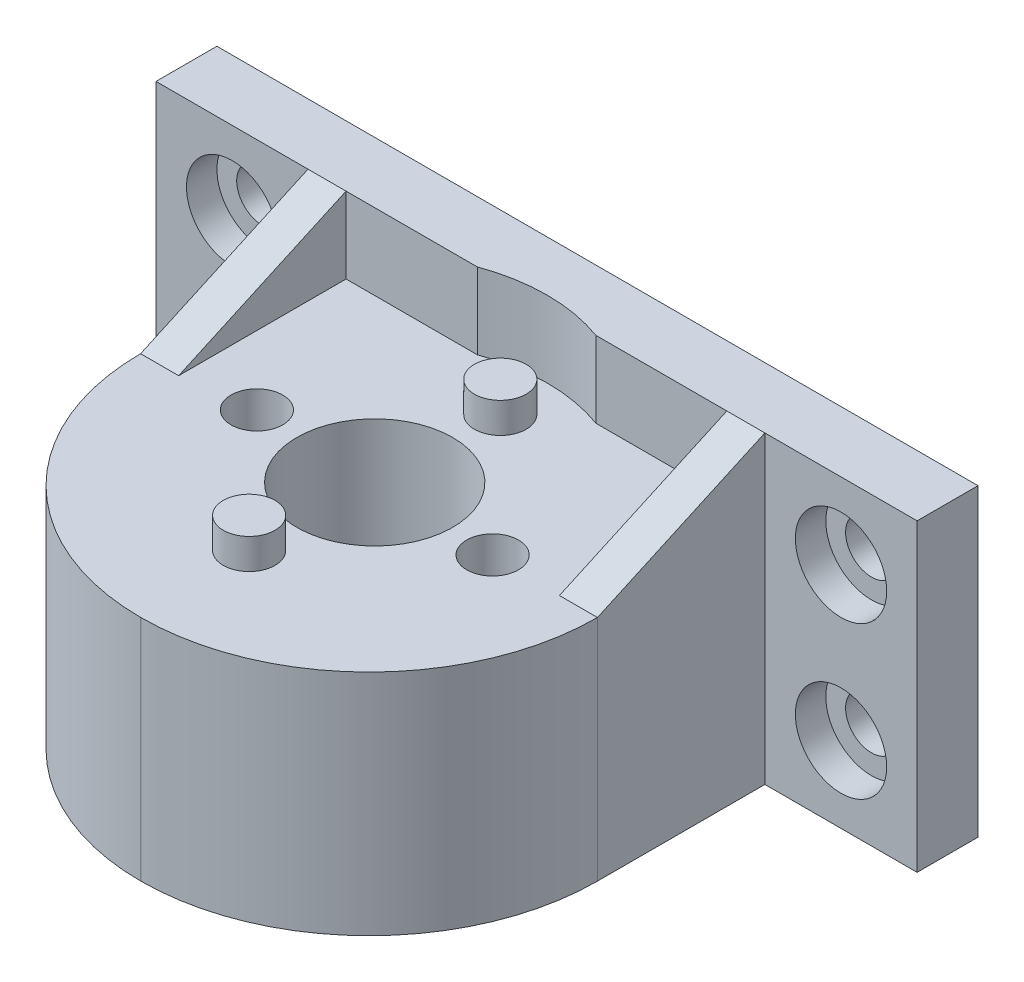
ISO-10303-21;
HEADER;
FILE_DESCRIPTION(('STEP AP214'),'2;1');
FILE_NAME('part.step','',(''),(''),'','','');
FILE_SCHEMA(('AUTOMOTIVE_DESIGN { 1 0 10303 214 1 1 1 1 }'));
ENDSEC;
DATA;
#1=APPLICATION_CONTEXT('core data for automotive mechanical design processes');
#2=APPLICATION_PROTOCOL_DEFINITION('international standard','automotive_design',2000,#1);
#3=PRODUCT_CONTEXT('',#1,'mechanical');
#4=PRODUCT('Part','Part','',(#3));
#5=PRODUCT_RELATED_PRODUCT_CATEGORY('part','',(#4));
#6=PRODUCT_DEFINITION_FORMATION('','',#4);
#7=PRODUCT_DEFINITION_CONTEXT('part definition',#1,'design');
#8=PRODUCT_DEFINITION('design','',#6,#7);
#9=PRODUCT_DEFINITION_SHAPE('','',#8);
#10=(LENGTH_UNIT() NAMED_UNIT(*) SI_UNIT(.MILLI.,.METRE.));
#11=(NAMED_UNIT(*) PLANE_ANGLE_UNIT() SI_UNIT($,.RADIAN.));
#12=(NAMED_UNIT(*) SI_UNIT($,.STERADIAN.) SOLID_ANGLE_UNIT());
#13=UNCERTAINTY_MEASURE_WITH_UNIT(LENGTH_MEASURE(1.E-05),#10,'distance_accuracy_value','');
#14=(GEOMETRIC_REPRESENTATION_CONTEXT(3) GLOBAL_UNCERTAINTY_ASSIGNED_CONTEXT((#13)) GLOBAL_UNIT_ASSIGNED_CONTEXT((#10,
#11,#12)) REPRESENTATION_CONTEXT('',''));
#15=CARTESIAN_POINT('',(0.,0.,0.));
#16=DIRECTION('',(0.,0.,1.));
#17=DIRECTION('',(1.,0.,0.));
#18=AXIS2_PLACEMENT_3D('',#15,#16,#17);
#19=CARTESIAN_POINT('',(0.,0.,4.));
#20=DIRECTION('',(0.,0.,1.));
#21=DIRECTION('',(1.,0.,0.));
#22=AXIS2_PLACEMENT_3D('',#19,#20,#21);
#23=PLANE('',#22);
#24=DIRECTION('',(-1.,0.,0.));
#25=VECTOR('',#24,1.);
#26=CARTESIAN_POINT('',(0.,75.,4.));
#27=LINE('',#26,#25);
#28=CARTESIAN_POINT('',(-139.9,75.,4.));
#29=VERTEX_POINT('',#28);
#30=CARTESIAN_POINT('',(-148.507432970957,75.,4.));
#31=VERTEX_POINT('',#30);
#32=EDGE_CURVE('E197',#29,#31,#27,.T.);
#33=ORIENTED_EDGE('',*,*,#32,.F.);
#34=DIRECTION('',(0.,-1.,0.));
#35=VECTOR('',#34,1.);
#36=CARTESIAN_POINT('',(-139.9,0.,4.));
#37=LINE('',#36,#35);
#38=CARTESIAN_POINT('',(-139.9,80.,4.));
#39=VERTEX_POINT('',#38);
#40=EDGE_CURVE('E189',#39,#29,#37,.T.);
#41=ORIENTED_EDGE('',*,*,#40,.F.);
#42=DIRECTION('',(1.,0.,0.));
#43=VECTOR('',#42,1.);
#44=CARTESIAN_POINT('',(0.,80.,4.));
#45=LINE('',#44,#43);
#46=CARTESIAN_POINT('',(-148.507432970957,80.,4.));
#47=VERTEX_POINT('',#46);
#48=EDGE_CURVE('E196',#47,#39,#45,.T.);
#49=ORIENTED_EDGE('',*,*,#48,.F.);
#50=DIRECTION('',(0.,1.,0.));
#51=VECTOR('',#50,1.);
#52=CARTESIAN_POINT('',(-148.507432970957,67.1843305884659,4.));
#53=LINE('',#52,#51);
#54=EDGE_CURVE('E924',#31,#47,#53,.T.);
#55=ORIENTED_EDGE('',*,*,#54,.F.);
#56=EDGE_LOOP('',(#33,#41,#49,#55));
#57=FACE_BOUND('',#56,.T.);
#58=ADVANCED_FACE('F51',(#57),#23,.T.);
#59=CARTESIAN_POINT('',(-164.914038192639,80.,4.));
#60=VERTEX_POINT('',#59);
#61=CARTESIAN_POINT('',(-156.292567029197,80.,4.));
#62=VERTEX_POINT('',#61);
#63=EDGE_CURVE('E66',#60,#62,#45,.T.);
#64=ORIENTED_EDGE('',*,*,#63,.F.);
#65=DIRECTION('',(0.,-1.,0.));
#66=VECTOR('',#65,1.);
#67=CARTESIAN_POINT('',(-164.914038192639,0.,4.));
#68=LINE('',#67,#66);
#69=CARTESIAN_POINT('',(-164.914038192639,75.,4.));
#70=VERTEX_POINT('',#69);
#71=EDGE_CURVE('E905',#60,#70,#68,.T.);
#72=ORIENTED_EDGE('',*,*,#71,.T.);
#73=CARTESIAN_POINT('',(-156.292567029197,75.,4.));
#74=VERTEX_POINT('',#73);
#75=EDGE_CURVE('E949',#74,#70,#27,.T.);
#76=ORIENTED_EDGE('',*,*,#75,.F.);
#77=DIRECTION('',(0.,1.,0.));
#78=VECTOR('',#77,1.);
#79=CARTESIAN_POINT('',(-156.292567029197,67.1843305884659,4.));
#80=LINE('',#79,#78);
#81=EDGE_CURVE('E928',#74,#62,#80,.T.);
#82=ORIENTED_EDGE('',*,*,#81,.T.);
#83=EDGE_LOOP('',(#64,#72,#76,#82));
#84=FACE_BOUND('',#83,.T.);
#85=ADVANCED_FACE('F398',(#84),#23,.T.);
#86=CARTESIAN_POINT('',(-137.4,80.,4.));
#87=VERTEX_POINT('',#86);
#88=CARTESIAN_POINT('',(-127.4,80.,4.));
#89=VERTEX_POINT('',#88);
#90=EDGE_CURVE('E203',#87,#89,#45,.T.);
#91=ORIENTED_EDGE('',*,*,#90,.F.);
#92=DIRECTION('',(0.,-1.,0.));
#93=VECTOR('',#92,1.);
#94=CARTESIAN_POINT('',(-137.4,75.,4.));
#95=LINE('',#94,#93);
#96=CARTESIAN_POINT('',(-137.4,60.,4.));
#97=VERTEX_POINT('',#96);
#98=EDGE_CURVE('E324',#87,#97,#95,.T.);
#99=ORIENTED_EDGE('',*,*,#98,.T.);
#100=DIRECTION('',(1.,0.,0.));
#101=VECTOR('',#100,1.);
#102=CARTESIAN_POINT('',(0.,60.,4.));
#103=LINE('',#102,#101);
#104=CARTESIAN_POINT('',(-127.4,60.,4.));
#105=VERTEX_POINT('',#104);
#106=EDGE_CURVE('E241',#97,#105,#103,.T.);
#107=ORIENTED_EDGE('',*,*,#106,.T.);
#108=DIRECTION('',(0.,-1.,0.));
#109=VECTOR('',#108,1.);
#110=CARTESIAN_POINT('',(-127.4,0.,4.));
#111=LINE('',#110,#109);
#112=EDGE_CURVE('E206',#89,#105,#111,.T.);
#113=ORIENTED_EDGE('',*,*,#112,.F.);
#114=EDGE_LOOP('',(#91,#99,#107,#113));
#115=FACE_BOUND('',#114,.T.);
#116=CARTESIAN_POINT('',(-132.4,65.,4.));
#117=DIRECTION('',(0.,0.,1.));
#118=DIRECTION('',(1.,0.,0.));
#119=AXIS2_PLACEMENT_3D('',#116,#117,#118);
#120=CIRCLE('',#119,2.99999999999999);
#121=CARTESIAN_POINT('',(-129.4,65.,4.));
#122=VERTEX_POINT('',#121);
#123=EDGE_CURVE('E323',#122,#122,#120,.T.);
#124=ORIENTED_EDGE('',*,*,#123,.F.);
#125=EDGE_LOOP('',(#124));
#126=FACE_BOUND('',#125,.T.);
#127=CARTESIAN_POINT('',(-132.4,75.,4.));
#128=DIRECTION('',(0.,0.,1.));
#129=DIRECTION('',(1.,0.,0.));
#130=AXIS2_PLACEMENT_3D('',#127,#128,#129);
#131=CIRCLE('',#130,2.99999999999999);
#132=CARTESIAN_POINT('',(-129.4,75.,4.));
#133=VERTEX_POINT('',#132);
#134=EDGE_CURVE('E329',#133,#133,#131,.T.);
#135=ORIENTED_EDGE('',*,*,#134,.F.);
#136=EDGE_LOOP('',(#135));
#137=FACE_BOUND('',#136,.T.);
#138=ADVANCED_FACE('F359',(#115,#126,#137),#23,.T.);
#139=CARTESIAN_POINT('',(-172.4,65.,4.));
#140=DIRECTION('',(0.,0.,-1.));
#141=DIRECTION('',(-1.,0.,0.));
#142=AXIS2_PLACEMENT_3D('',#139,#140,#141);
#143=CYLINDRICAL_SURFACE('',#142,1.70000000000001);
#144=DIRECTION('',(0.,0.,-1.));
#145=VECTOR('',#144,1.);
#146=CARTESIAN_POINT('',(-174.1,65.,4.));
#147=LINE('',#146,#145);
#148=CARTESIAN_POINT('',(-174.1,65.,2.));
#149=VERTEX_POINT('',#148);
#150=CARTESIAN_POINT('',(-174.1,65.,0.));
#151=VERTEX_POINT('',#150);
#152=EDGE_CURVE('E214',#149,#151,#147,.T.);
#153=ORIENTED_EDGE('',*,*,#152,.F.);
#154=CARTESIAN_POINT('',(-172.4,65.,2.));
#155=DIRECTION('',(0.,0.,1.));
#156=DIRECTION('',(1.,0.,0.));
#157=AXIS2_PLACEMENT_3D('',#154,#155,#156);
#158=CIRCLE('',#157,1.70000000000001);
#159=CARTESIAN_POINT('',(-172.4,63.3,2.));
#160=VERTEX_POINT('',#159);
#161=EDGE_CURVE('E263',#149,#160,#158,.T.);
#162=ORIENTED_EDGE('',*,*,#161,.T.);
#163=DIRECTION('',(0.,0.,-1.));
#164=VECTOR('',#163,1.);
#165=CARTESIAN_POINT('',(-172.4,63.3,4.));
#166=LINE('',#165,#164);
#167=CARTESIAN_POINT('',(-172.4,63.3,0.));
#168=VERTEX_POINT('',#167);
#169=EDGE_CURVE('E211',#160,#168,#166,.T.);
#170=ORIENTED_EDGE('',*,*,#169,.T.);
#171=CARTESIAN_POINT('',(-172.4,65.,0.));
#172=DIRECTION('',(0.,0.,1.));
#173=DIRECTION('',(1.,0.,0.));
#174=AXIS2_PLACEMENT_3D('',#171,#172,#173);
#175=CIRCLE('',#174,1.70000000000001);
#176=EDGE_CURVE('E227',#151,#168,#175,.T.);
#177=ORIENTED_EDGE('',*,*,#176,.F.);
#178=EDGE_LOOP('',(#153,#162,#170,#177));
#179=FACE_BOUND('',#178,.T.);
#180=ADVANCED_FACE('F415',(#179),#143,.F.);
#181=CARTESIAN_POINT('',(-172.4,75.,4.));
#182=DIRECTION('',(0.,0.,-1.));
#183=DIRECTION('',(-1.,0.,0.));
#184=AXIS2_PLACEMENT_3D('',#181,#182,#183);
#185=CYLINDRICAL_SURFACE('',#184,1.70000000000001);
#186=CARTESIAN_POINT('',(-172.4,75.,0.));
#187=DIRECTION('',(0.,0.,1.));
#188=DIRECTION('',(1.,0.,0.));
#189=AXIS2_PLACEMENT_3D('',#186,#187,#188);
#190=CIRCLE('',#189,1.70000000000001);
#191=CARTESIAN_POINT('',(-170.7,75.,0.));
#192=VERTEX_POINT('',#191);
#193=EDGE_CURVE('E224',#192,#192,#190,.T.);
#194=ORIENTED_EDGE('',*,*,#193,.F.);
#195=EDGE_LOOP('',(#194));
#196=FACE_BOUND('',#195,.T.);
#197=CARTESIAN_POINT('',(-172.4,75.,2.));
#198=DIRECTION('',(0.,0.,1.));
#199=DIRECTION('',(1.,0.,0.));
#200=AXIS2_PLACEMENT_3D('',#197,#198,#199);
#201=CIRCLE('',#200,1.70000000000001);
#202=CARTESIAN_POINT('',(-170.7,75.,2.));
#203=VERTEX_POINT('',#202);
#204=EDGE_CURVE('E221',#203,#203,#201,.T.);
#205=ORIENTED_EDGE('',*,*,#204,.T.);
#206=EDGE_LOOP('',(#205));
#207=FACE_BOUND('',#206,.T.);
#208=ADVANCED_FACE('F418',(#196,#207),#185,.F.);
#209=CARTESIAN_POINT('',(-132.4,75.,4.));
#210=DIRECTION('',(0.,0.,-1.));
#211=DIRECTION('',(-1.,0.,0.));
#212=AXIS2_PLACEMENT_3D('',#209,#210,#211);
#213=CYLINDRICAL_SURFACE('',#212,1.70000000000001);
#214=CARTESIAN_POINT('',(-132.4,75.,0.));
#215=DIRECTION('',(0.,0.,1.));
#216=DIRECTION('',(1.,0.,0.));
#217=AXIS2_PLACEMENT_3D('',#214,#215,#216);
#218=CIRCLE('',#217,1.70000000000001);
#219=CARTESIAN_POINT('',(-130.7,75.,0.));
#220=VERTEX_POINT('',#219);
#221=EDGE_CURVE('E220',#220,#220,#218,.T.);
#222=ORIENTED_EDGE('',*,*,#221,.F.);
#223=EDGE_LOOP('',(#222));
#224=FACE_BOUND('',#223,.T.);
#225=CARTESIAN_POINT('',(-132.4,75.,2.));
#226=DIRECTION('',(0.,0.,1.));
#227=DIRECTION('',(1.,0.,0.));
#228=AXIS2_PLACEMENT_3D('',#225,#226,#227);
#229=CIRCLE('',#228,1.70000000000001);
#230=CARTESIAN_POINT('',(-130.7,75.,2.));
#231=VERTEX_POINT('',#230);
#232=EDGE_CURVE('E262',#231,#231,#229,.T.);
#233=ORIENTED_EDGE('',*,*,#232,.T.);
#234=EDGE_LOOP('',(#233));
#235=FACE_BOUND('',#234,.T.);
#236=ADVANCED_FACE('F422',(#224,#235),#213,.F.);
#237=CARTESIAN_POINT('',(-132.4,65.,4.));
#238=DIRECTION('',(0.,0.,-1.));
#239=DIRECTION('',(-1.,0.,0.));
#240=AXIS2_PLACEMENT_3D('',#237,#238,#239);
#241=CYLINDRICAL_SURFACE('',#240,1.70000000000001);
#242=CARTESIAN_POINT('',(-132.4,65.,0.));
#243=DIRECTION('',(0.,0.,1.));
#244=DIRECTION('',(1.,0.,0.));
#245=AXIS2_PLACEMENT_3D('',#242,#243,#244);
#246=CIRCLE('',#245,1.70000000000001);
#247=CARTESIAN_POINT('',(-130.7,65.,0.));
#248=VERTEX_POINT('',#247);
#249=EDGE_CURVE('E217',#248,#248,#246,.T.);
#250=ORIENTED_EDGE('',*,*,#249,.F.);
#251=EDGE_LOOP('',(#250));
#252=FACE_BOUND('',#251,.T.);
#253=CARTESIAN_POINT('',(-132.4,65.,2.));
#254=DIRECTION('',(0.,0.,1.));
#255=DIRECTION('',(1.,0.,0.));
#256=AXIS2_PLACEMENT_3D('',#253,#254,#255);
#257=CIRCLE('',#256,1.70000000000001);
#258=CARTESIAN_POINT('',(-130.7,65.,2.));
#259=VERTEX_POINT('',#258);
#260=EDGE_CURVE('E259',#259,#259,#257,.T.);
#261=ORIENTED_EDGE('',*,*,#260,.T.);
#262=EDGE_LOOP('',(#261));
#263=FACE_BOUND('',#262,.T.);
#264=ADVANCED_FACE('F426',(#252,#263),#241,.F.);
#265=CARTESIAN_POINT('',(-172.4,65.,4.));
#266=DIRECTION('',(0.,0.,-1.));
#267=DIRECTION('',(-1.,0.,0.));
#268=AXIS2_PLACEMENT_3D('',#265,#266,#267);
#269=CYLINDRICAL_SURFACE('',#268,1.70000000000001);
#270=ORIENTED_EDGE('',*,*,#169,.F.);
#271=CARTESIAN_POINT('',(-172.4,65.,2.));
#272=DIRECTION('',(0.,0.,1.));
#273=DIRECTION('',(1.,0.,0.));
#274=AXIS2_PLACEMENT_3D('',#271,#272,#273);
#275=CIRCLE('',#274,1.70000000000001);
#276=EDGE_CURVE('E255',#160,#149,#275,.T.);
#277=ORIENTED_EDGE('',*,*,#276,.T.);
#278=ORIENTED_EDGE('',*,*,#152,.T.);
#279=CARTESIAN_POINT('',(-172.4,65.,0.));
#280=DIRECTION('',(0.,0.,1.));
#281=DIRECTION('',(1.,0.,0.));
#282=AXIS2_PLACEMENT_3D('',#279,#280,#281);
#283=CIRCLE('',#282,1.70000000000001);
#284=EDGE_CURVE('E250',#151,#168,#283,.F.);
#285=ORIENTED_EDGE('',*,*,#284,.T.);
#286=EDGE_LOOP('',(#270,#277,#278,#285));
#287=FACE_BOUND('',#286,.T.);
#288=ADVANCED_FACE('F373',(#287),#269,.F.);
#289=DIRECTION('',(0.,-1.,0.));
#290=VECTOR('',#289,1.);
#291=CARTESIAN_POINT('',(-167.414038192639,75.,4.));
#292=LINE('',#291,#290);
#293=CARTESIAN_POINT('',(-167.414038192639,80.,4.));
#294=VERTEX_POINT('',#293);
#295=CARTESIAN_POINT('',(-167.414038192639,60.,4.));
#296=VERTEX_POINT('',#295);
#297=EDGE_CURVE('E74',#294,#296,#292,.T.);
#298=ORIENTED_EDGE('',*,*,#297,.F.);
#299=CARTESIAN_POINT('',(-177.4,80.,4.));
#300=VERTEX_POINT('',#299);
#301=EDGE_CURVE('E205',#300,#294,#45,.T.);
#302=ORIENTED_EDGE('',*,*,#301,.F.);
#303=DIRECTION('',(0.,-1.,0.));
#304=VECTOR('',#303,1.);
#305=CARTESIAN_POINT('',(-177.4,0.,4.));
#306=LINE('',#305,#304);
#307=CARTESIAN_POINT('',(-177.4,60.,4.));
#308=VERTEX_POINT('',#307);
#309=EDGE_CURVE('E209',#300,#308,#306,.T.);
#310=ORIENTED_EDGE('',*,*,#309,.T.);
#311=EDGE_CURVE('E351',#308,#296,#103,.T.);
#312=ORIENTED_EDGE('',*,*,#311,.T.);
#313=EDGE_LOOP('',(#298,#302,#310,#312));
#314=FACE_BOUND('',#313,.T.);
#315=CARTESIAN_POINT('',(-172.4,65.,4.));
#316=DIRECTION('',(0.,0.,1.));
#317=DIRECTION('',(1.,0.,0.));
#318=AXIS2_PLACEMENT_3D('',#315,#316,#317);
#319=CIRCLE('',#318,2.99999999999999);
#320=CARTESIAN_POINT('',(-169.4,65.,4.));
#321=VERTEX_POINT('',#320);
#322=EDGE_CURVE('E336',#321,#321,#319,.T.);
#323=ORIENTED_EDGE('',*,*,#322,.F.);
#324=EDGE_LOOP('',(#323));
#325=FACE_BOUND('',#324,.T.);
#326=CARTESIAN_POINT('',(-172.4,75.,4.));
#327=DIRECTION('',(0.,0.,1.));
#328=DIRECTION('',(1.,0.,0.));
#329=AXIS2_PLACEMENT_3D('',#326,#327,#328);
#330=CIRCLE('',#329,2.99999999999999);
#331=CARTESIAN_POINT('',(-169.4,75.,4.));
#332=VERTEX_POINT('',#331);
#333=EDGE_CURVE('E335',#332,#332,#330,.T.);
#334=ORIENTED_EDGE('',*,*,#333,.F.);
#335=EDGE_LOOP('',(#334));
#336=FACE_BOUND('',#335,.T.);
#337=ADVANCED_FACE('F370',(#314,#325,#336),#23,.T.);
#338=CARTESIAN_POINT('',(0.,0.,0.));
#339=DIRECTION('',(0.,0.,1.));
#340=DIRECTION('',(1.,0.,0.));
#341=AXIS2_PLACEMENT_3D('',#338,#339,#340);
#342=PLANE('',#341);
#343=DIRECTION('',(1.,0.,0.));
#344=VECTOR('',#343,1.);
#345=CARTESIAN_POINT('',(0.,60.,0.));
#346=LINE('',#345,#344);
#347=CARTESIAN_POINT('',(-177.4,60.,0.));
#348=VERTEX_POINT('',#347);
#349=CARTESIAN_POINT('',(-127.4,60.,0.));
#350=VERTEX_POINT('',#349);
#351=EDGE_CURVE('E230',#348,#350,#346,.T.);
#352=ORIENTED_EDGE('',*,*,#351,.F.);
#353=DIRECTION('',(0.,-1.,0.));
#354=VECTOR('',#353,1.);
#355=CARTESIAN_POINT('',(-177.4,0.,0.));
#356=LINE('',#355,#354);
#357=CARTESIAN_POINT('',(-177.4,80.,0.));
#358=VERTEX_POINT('',#357);
#359=EDGE_CURVE('E239',#358,#348,#356,.T.);
#360=ORIENTED_EDGE('',*,*,#359,.F.);
#361=DIRECTION('',(1.,0.,0.));
#362=VECTOR('',#361,1.);
#363=CARTESIAN_POINT('',(0.,80.,0.));
#364=LINE('',#363,#362);
#365=CARTESIAN_POINT('',(-127.4,80.,0.));
#366=VERTEX_POINT('',#365);
#367=EDGE_CURVE('E236',#358,#366,#364,.T.);
#368=ORIENTED_EDGE('',*,*,#367,.T.);
#369=DIRECTION('',(0.,-1.,0.));
#370=VECTOR('',#369,1.);
#371=CARTESIAN_POINT('',(-127.4,0.,0.));
#372=LINE('',#371,#370);
#373=EDGE_CURVE('E233',#366,#350,#372,.T.);
#374=ORIENTED_EDGE('',*,*,#373,.T.);
#375=EDGE_LOOP('',(#352,#360,#368,#374));
#376=FACE_BOUND('',#375,.T.);
#377=ORIENTED_EDGE('',*,*,#193,.T.);
#378=EDGE_LOOP('',(#377));
#379=FACE_BOUND('',#378,.T.);
#380=ORIENTED_EDGE('',*,*,#221,.T.);
#381=EDGE_LOOP('',(#380));
#382=FACE_BOUND('',#381,.T.);
#383=ORIENTED_EDGE('',*,*,#249,.T.);
#384=EDGE_LOOP('',(#383));
#385=FACE_BOUND('',#384,.T.);
#386=ORIENTED_EDGE('',*,*,#284,.F.);
#387=ORIENTED_EDGE('',*,*,#176,.T.);
#388=EDGE_LOOP('',(#386,#387));
#389=FACE_BOUND('',#388,.T.);
#390=ADVANCED_FACE('F365',(#376,#379,#382,#385,#389),#342,.F.);
#391=CARTESIAN_POINT('',(0.,60.,4.));
#392=DIRECTION('',(0.,1.,0.));
#393=DIRECTION('',(0.,0.,1.));
#394=AXIS2_PLACEMENT_3D('',#391,#392,#393);
#395=PLANE('',#394);
#396=CARTESIAN_POINT('',(-160.3959884142,60.,14.3781684729765));
#397=DIRECTION('',(0.,1.,0.));
#398=DIRECTION('',(0.,0.,1.));
#399=AXIS2_PLACEMENT_3D('',#396,#397,#398);
#400=CIRCLE('',#399,1.70000000000001);
#401=CARTESIAN_POINT('',(-160.3959884142,60.,16.0781684729765));
#402=VERTEX_POINT('',#401);
#403=EDGE_CURVE('E940',#402,#402,#400,.T.);
#404=ORIENTED_EDGE('',*,*,#403,.T.);
#405=EDGE_LOOP('',(#404));
#406=FACE_BOUND('',#405,.T.);
#407=CARTESIAN_POINT('',(-144.404011585956,60.,14.8848015995177));
#408=DIRECTION('',(0.,1.,0.));
#409=DIRECTION('',(0.,0.,1.));
#410=AXIS2_PLACEMENT_3D('',#407,#408,#409);
#411=CIRCLE('',#410,1.70000000000001);
#412=CARTESIAN_POINT('',(-144.404011585956,60.,16.5848015995177));
#413=VERTEX_POINT('',#412);
#414=EDGE_CURVE('E935',#413,#413,#411,.T.);
#415=ORIENTED_EDGE('',*,*,#414,.T.);
#416=EDGE_LOOP('',(#415));
#417=FACE_BOUND('',#416,.T.);
#418=DIRECTION('',(0.,0.,1.));
#419=VECTOR('',#418,1.);
#420=CARTESIAN_POINT('',(-137.4,60.,0.));
#421=LINE('',#420,#419);
#422=CARTESIAN_POINT('',(-137.4,60.,15.));
#423=VERTEX_POINT('',#422);
#424=EDGE_CURVE('E300',#97,#423,#421,.T.);
#425=ORIENTED_EDGE('',*,*,#424,.T.);
#426=CARTESIAN_POINT('',(-152.4,60.,15.));
#427=DIRECTION('',(0.,1.,0.));
#428=DIRECTION('',(0.,0.,1.));
#429=AXIS2_PLACEMENT_3D('',#426,#427,#428);
#430=CIRCLE('',#429,15.);
#431=CARTESIAN_POINT('',(-152.4,60.,30.));
#432=VERTEX_POINT('',#431);
#433=EDGE_CURVE('E278',#423,#432,#430,.F.);
#434=ORIENTED_EDGE('',*,*,#433,.T.);
#435=DIRECTION('',(1.,0.,0.));
#436=VECTOR('',#435,1.);
#437=CARTESIAN_POINT('',(0.,60.,30.));
#438=LINE('',#437,#436);
#439=CARTESIAN_POINT('',(-152.414038192639,60.,30.));
#440=VERTEX_POINT('',#439);
#441=EDGE_CURVE('E309',#440,#432,#438,.T.);
#442=ORIENTED_EDGE('',*,*,#441,.F.);
#443=CARTESIAN_POINT('',(-152.414038192639,60.,15.));
#444=DIRECTION('',(0.,1.,0.));
#445=DIRECTION('',(0.,0.,1.));
#446=AXIS2_PLACEMENT_3D('',#443,#444,#445);
#447=CIRCLE('',#446,15.);
#448=CARTESIAN_POINT('',(-167.414038192639,60.,15.));
#449=VERTEX_POINT('',#448);
#450=EDGE_CURVE('E276',#440,#449,#447,.F.);
#451=ORIENTED_EDGE('',*,*,#450,.T.);
#452=DIRECTION('',(0.,0.,1.));
#453=VECTOR('',#452,1.);
#454=CARTESIAN_POINT('',(-167.414038192639,60.,0.));
#455=LINE('',#454,#453);
#456=EDGE_CURVE('E312',#296,#449,#455,.T.);
#457=ORIENTED_EDGE('',*,*,#456,.F.);
#458=ORIENTED_EDGE('',*,*,#311,.F.);
#459=DIRECTION('',(0.,0.,-1.));
#460=VECTOR('',#459,1.);
#461=CARTESIAN_POINT('',(-177.4,60.,4.));
#462=LINE('',#461,#460);
#463=EDGE_CURVE('E242',#308,#348,#462,.T.);
#464=ORIENTED_EDGE('',*,*,#463,.T.);
#465=ORIENTED_EDGE('',*,*,#351,.T.);
#466=DIRECTION('',(0.,0.,-1.));
#467=VECTOR('',#466,1.);
#468=CARTESIAN_POINT('',(-127.4,60.,4.));
#469=LINE('',#468,#467);
#470=EDGE_CURVE('E249',#105,#350,#469,.T.);
#471=ORIENTED_EDGE('',*,*,#470,.F.);
#472=ORIENTED_EDGE('',*,*,#106,.F.);
#473=EDGE_LOOP('',(#425,#434,#442,#451,#457,#458,#464,#465,#471,#472));
#474=FACE_BOUND('',#473,.T.);
#475=CARTESIAN_POINT('',(-152.400000000077,60.,14.6314850362471));
#476=DIRECTION('',(0.,-1.,0.));
#477=DIRECTION('',(0.,0.,-1.));
#478=AXIS2_PLACEMENT_3D('',#475,#476,#477);
#479=CIRCLE('',#478,5.12000000000001);
#480=CARTESIAN_POINT('',(-152.400000000077,60.,9.51148503624708));
#481=VERTEX_POINT('',#480);
#482=EDGE_CURVE('E310',#481,#481,#479,.T.);
#483=ORIENTED_EDGE('',*,*,#482,.F.);
#484=EDGE_LOOP('',(#483));
#485=FACE_BOUND('',#484,.T.);
#486=ADVANCED_FACE('F304',(#406,#417,#474,#485),#395,.F.);
#487=CARTESIAN_POINT('',(-127.4,0.,4.));
#488=DIRECTION('',(1.,0.,0.));
#489=DIRECTION('',(0.,0.,-1.));
#490=AXIS2_PLACEMENT_3D('',#487,#488,#489);
#491=PLANE('',#490);
#492=ORIENTED_EDGE('',*,*,#373,.F.);
#493=DIRECTION('',(0.,0.,-1.));
#494=VECTOR('',#493,1.);
#495=CARTESIAN_POINT('',(-127.4,80.,4.));
#496=LINE('',#495,#494);
#497=EDGE_CURVE('E247',#89,#366,#496,.T.);
#498=ORIENTED_EDGE('',*,*,#497,.F.);
#499=ORIENTED_EDGE('',*,*,#112,.T.);
#500=ORIENTED_EDGE('',*,*,#470,.T.);
#501=EDGE_LOOP('',(#492,#498,#499,#500));
#502=FACE_BOUND('',#501,.T.);
#503=ADVANCED_FACE('F357',(#502),#491,.T.);
#504=CARTESIAN_POINT('',(0.,80.,4.));
#505=DIRECTION('',(0.,1.,0.));
#506=DIRECTION('',(0.,0.,1.));
#507=AXIS2_PLACEMENT_3D('',#504,#505,#506);
#508=PLANE('',#507);
#509=CARTESIAN_POINT('',(-152.400000000077,80.,14.6314850362471));
#510=DIRECTION('',(0.,1.,0.));
#511=DIRECTION('',(0.,0.,-1.));
#512=AXIS2_PLACEMENT_3D('',#509,#510,#511);
#513=CIRCLE('',#512,11.321685040317);
#514=EDGE_CURVE('E202',#47,#62,#513,.T.);
#515=ORIENTED_EDGE('',*,*,#514,.F.);
#516=ORIENTED_EDGE('',*,*,#48,.T.);
#517=DIRECTION('',(1.,0.,0.));
#518=VECTOR('',#517,1.);
#519=CARTESIAN_POINT('',(-139.9,80.,4.));
#520=LINE('',#519,#518);
#521=EDGE_CURVE('E173',#39,#87,#520,.T.);
#522=ORIENTED_EDGE('',*,*,#521,.T.);
#523=ORIENTED_EDGE('',*,*,#90,.T.);
#524=ORIENTED_EDGE('',*,*,#497,.T.);
#525=ORIENTED_EDGE('',*,*,#367,.F.);
#526=DIRECTION('',(0.,0.,-1.));
#527=VECTOR('',#526,1.);
#528=CARTESIAN_POINT('',(-177.4,80.,4.));
#529=LINE('',#528,#527);
#530=EDGE_CURVE('E245',#300,#358,#529,.T.);
#531=ORIENTED_EDGE('',*,*,#530,.F.);
#532=ORIENTED_EDGE('',*,*,#301,.T.);
#533=DIRECTION('',(-1.,0.,0.));
#534=VECTOR('',#533,1.);
#535=CARTESIAN_POINT('',(-164.914038192639,80.,4.));
#536=LINE('',#535,#534);
#537=EDGE_CURVE('E920',#60,#294,#536,.T.);
#538=ORIENTED_EDGE('',*,*,#537,.F.);
#539=ORIENTED_EDGE('',*,*,#63,.T.);
#540=EDGE_LOOP('',(#515,#516,#522,#523,#524,#525,#531,#532,#538,#539));
#541=FACE_BOUND('',#540,.T.);
#542=ADVANCED_FACE('F200',(#541),#508,.T.);
#543=CARTESIAN_POINT('',(-177.4,0.,4.));
#544=DIRECTION('',(1.,0.,0.));
#545=DIRECTION('',(0.,0.,-1.));
#546=AXIS2_PLACEMENT_3D('',#543,#544,#545);
#547=PLANE('',#546);
#548=ORIENTED_EDGE('',*,*,#359,.T.);
#549=ORIENTED_EDGE('',*,*,#463,.F.);
#550=ORIENTED_EDGE('',*,*,#309,.F.);
#551=ORIENTED_EDGE('',*,*,#530,.T.);
#552=EDGE_LOOP('',(#548,#549,#550,#551));
#553=FACE_BOUND('',#552,.T.);
#554=ADVANCED_FACE('F369',(#553),#547,.F.);
#555=CARTESIAN_POINT('',(-172.4,65.,2.));
#556=DIRECTION('',(0.,0.,1.));
#557=DIRECTION('',(1.,0.,0.));
#558=AXIS2_PLACEMENT_3D('',#555,#556,#557);
#559=CYLINDRICAL_SURFACE('',#558,2.99999999999999);
#560=CARTESIAN_POINT('',(-172.4,65.,2.));
#561=DIRECTION('',(0.,0.,1.));
#562=DIRECTION('',(1.,0.,0.));
#563=AXIS2_PLACEMENT_3D('',#560,#561,#562);
#564=CIRCLE('',#563,2.99999999999999);
#565=CARTESIAN_POINT('',(-169.4,65.,2.));
#566=VERTEX_POINT('',#565);
#567=EDGE_CURVE('E332',#566,#566,#564,.T.);
#568=ORIENTED_EDGE('',*,*,#567,.F.);
#569=EDGE_LOOP('',(#568));
#570=FACE_BOUND('',#569,.T.);
#571=ORIENTED_EDGE('',*,*,#322,.T.);
#572=EDGE_LOOP('',(#571));
#573=FACE_BOUND('',#572,.T.);
#574=ADVANCED_FACE('F407',(#570,#573),#559,.F.);
#575=CARTESIAN_POINT('',(-172.4,65.,2.));
#576=DIRECTION('',(0.,0.,1.));
#577=DIRECTION('',(1.,0.,0.));
#578=AXIS2_PLACEMENT_3D('',#575,#576,#577);
#579=PLANE('',#578);
#580=ORIENTED_EDGE('',*,*,#276,.F.);
#581=ORIENTED_EDGE('',*,*,#161,.F.);
#582=EDGE_LOOP('',(#580,#581));
#583=FACE_BOUND('',#582,.T.);
#584=ORIENTED_EDGE('',*,*,#567,.T.);
#585=EDGE_LOOP('',(#584));
#586=FACE_BOUND('',#585,.T.);
#587=ADVANCED_FACE('F481',(#583,#586),#579,.T.);
#588=CARTESIAN_POINT('',(-132.4,65.,2.));
#589=DIRECTION('',(0.,0.,1.));
#590=DIRECTION('',(1.,0.,0.));
#591=AXIS2_PLACEMENT_3D('',#588,#589,#590);
#592=CYLINDRICAL_SURFACE('',#591,2.99999999999999);
#593=CARTESIAN_POINT('',(-132.4,65.,2.));
#594=DIRECTION('',(0.,0.,1.));
#595=DIRECTION('',(1.,0.,0.));
#596=AXIS2_PLACEMENT_3D('',#593,#594,#595);
#597=CIRCLE('',#596,2.99999999999999);
#598=CARTESIAN_POINT('',(-129.4,65.,2.));
#599=VERTEX_POINT('',#598);
#600=EDGE_CURVE('E326',#599,#599,#597,.T.);
#601=ORIENTED_EDGE('',*,*,#600,.F.);
#602=EDGE_LOOP('',(#601));
#603=FACE_BOUND('',#602,.T.);
#604=ORIENTED_EDGE('',*,*,#123,.T.);
#605=EDGE_LOOP('',(#604));
#606=FACE_BOUND('',#605,.T.);
#607=ADVANCED_FACE('F477',(#603,#606),#592,.F.);
#608=CARTESIAN_POINT('',(-132.4,65.,2.));
#609=DIRECTION('',(0.,0.,1.));
#610=DIRECTION('',(1.,0.,0.));
#611=AXIS2_PLACEMENT_3D('',#608,#609,#610);
#612=PLANE('',#611);
#613=ORIENTED_EDGE('',*,*,#260,.F.);
#614=EDGE_LOOP('',(#613));
#615=FACE_BOUND('',#614,.T.);
#616=ORIENTED_EDGE('',*,*,#600,.T.);
#617=EDGE_LOOP('',(#616));
#618=FACE_BOUND('',#617,.T.);
#619=ADVANCED_FACE('F474',(#615,#618),#612,.T.);
#620=CARTESIAN_POINT('',(-132.4,75.,2.));
#621=DIRECTION('',(0.,0.,1.));
#622=DIRECTION('',(1.,0.,0.));
#623=AXIS2_PLACEMENT_3D('',#620,#621,#622);
#624=CYLINDRICAL_SURFACE('',#623,2.99999999999999);
#625=CARTESIAN_POINT('',(-132.4,75.,2.));
#626=DIRECTION('',(0.,0.,1.));
#627=DIRECTION('',(1.,0.,0.));
#628=AXIS2_PLACEMENT_3D('',#625,#626,#627);
#629=CIRCLE('',#628,2.99999999999999);
#630=CARTESIAN_POINT('',(-129.4,75.,2.));
#631=VERTEX_POINT('',#630);
#632=EDGE_CURVE('E339',#631,#631,#629,.T.);
#633=ORIENTED_EDGE('',*,*,#632,.F.);
#634=EDGE_LOOP('',(#633));
#635=FACE_BOUND('',#634,.T.);
#636=ORIENTED_EDGE('',*,*,#134,.T.);
#637=EDGE_LOOP('',(#636));
#638=FACE_BOUND('',#637,.T.);
#639=ADVANCED_FACE('F392',(#635,#638),#624,.F.);
#640=CARTESIAN_POINT('',(-132.4,75.,2.));
#641=DIRECTION('',(0.,0.,1.));
#642=DIRECTION('',(1.,0.,0.));
#643=AXIS2_PLACEMENT_3D('',#640,#641,#642);
#644=PLANE('',#643);
#645=ORIENTED_EDGE('',*,*,#232,.F.);
#646=EDGE_LOOP('',(#645));
#647=FACE_BOUND('',#646,.T.);
#648=ORIENTED_EDGE('',*,*,#632,.T.);
#649=EDGE_LOOP('',(#648));
#650=FACE_BOUND('',#649,.T.);
#651=ADVANCED_FACE('F382',(#647,#650),#644,.T.);
#652=CARTESIAN_POINT('',(-172.4,75.,2.));
#653=DIRECTION('',(0.,0.,1.));
#654=DIRECTION('',(1.,0.,0.));
#655=AXIS2_PLACEMENT_3D('',#652,#653,#654);
#656=CYLINDRICAL_SURFACE('',#655,2.99999999999999);
#657=CARTESIAN_POINT('',(-172.4,75.,2.));
#658=DIRECTION('',(0.,0.,1.));
#659=DIRECTION('',(1.,0.,0.));
#660=AXIS2_PLACEMENT_3D('',#657,#658,#659);
#661=CIRCLE('',#660,2.99999999999999);
#662=CARTESIAN_POINT('',(-169.4,75.,2.));
#663=VERTEX_POINT('',#662);
#664=EDGE_CURVE('E344',#663,#663,#661,.T.);
#665=ORIENTED_EDGE('',*,*,#664,.F.);
#666=EDGE_LOOP('',(#665));
#667=FACE_BOUND('',#666,.T.);
#668=ORIENTED_EDGE('',*,*,#333,.T.);
#669=EDGE_LOOP('',(#668));
#670=FACE_BOUND('',#669,.T.);
#671=ADVANCED_FACE('F379',(#667,#670),#656,.F.);
#672=CARTESIAN_POINT('',(-172.4,75.,2.));
#673=DIRECTION('',(0.,0.,1.));
#674=DIRECTION('',(1.,0.,0.));
#675=AXIS2_PLACEMENT_3D('',#672,#673,#674);
#676=PLANE('',#675);
#677=ORIENTED_EDGE('',*,*,#204,.F.);
#678=EDGE_LOOP('',(#677));
#679=FACE_BOUND('',#678,.T.);
#680=ORIENTED_EDGE('',*,*,#664,.T.);
#681=EDGE_LOOP('',(#680));
#682=FACE_BOUND('',#681,.T.);
#683=ADVANCED_FACE('F381',(#679,#682),#676,.T.);
#684=CARTESIAN_POINT('',(-167.414038192639,75.,0.));
#685=DIRECTION('',(1.,0.,0.));
#686=DIRECTION('',(0.,0.,-1.));
#687=AXIS2_PLACEMENT_3D('',#684,#685,#686);
#688=PLANE('',#687);
#689=ORIENTED_EDGE('',*,*,#456,.T.);
#690=DIRECTION('',(0.,-1.,0.));
#691=VECTOR('',#690,1.);
#692=CARTESIAN_POINT('',(-167.414038192639,75.,15.));
#693=LINE('',#692,#691);
#694=CARTESIAN_POINT('',(-167.414038192639,75.,15.));
#695=VERTEX_POINT('',#694);
#696=EDGE_CURVE('E12',#449,#695,#693,.F.);
#697=ORIENTED_EDGE('',*,*,#696,.T.);
#698=DIRECTION('',(0.,0.413802944301184,-0.910366477462605));
#699=VECTOR('',#698,1.);
#700=CARTESIAN_POINT('',(-167.414038192639,67.8082191780822,30.8219178082192));
#701=LINE('',#700,#699);
#702=EDGE_CURVE('E911',#695,#294,#701,.T.);
#703=ORIENTED_EDGE('',*,*,#702,.T.);
#704=ORIENTED_EDGE('',*,*,#297,.T.);
#705=EDGE_LOOP('',(#689,#697,#703,#704));
#706=FACE_BOUND('',#705,.T.);
#707=ADVANCED_FACE('F389',(#706),#688,.F.);
#708=CARTESIAN_POINT('',(0.,75.,30.));
#709=DIRECTION('',(0.,0.,-1.));
#710=DIRECTION('',(-1.,0.,0.));
#711=AXIS2_PLACEMENT_3D('',#708,#709,#710);
#712=PLANE('',#711);
#713=ORIENTED_EDGE('',*,*,#441,.T.);
#714=DIRECTION('',(0.,-1.,0.));
#715=VECTOR('',#714,1.);
#716=CARTESIAN_POINT('',(-152.4,75.,30.));
#717=LINE('',#716,#715);
#718=CARTESIAN_POINT('',(-152.4,75.,30.));
#719=VERTEX_POINT('',#718);
#720=EDGE_CURVE('E283',#432,#719,#717,.F.);
#721=ORIENTED_EDGE('',*,*,#720,.T.);
#722=DIRECTION('',(1.,0.,0.));
#723=VECTOR('',#722,1.);
#724=CARTESIAN_POINT('',(0.,75.,30.));
#725=LINE('',#724,#723);
#726=CARTESIAN_POINT('',(-152.414038192639,75.,30.));
#727=VERTEX_POINT('',#726);
#728=EDGE_CURVE('E293',#727,#719,#725,.T.);
#729=ORIENTED_EDGE('',*,*,#728,.F.);
#730=DIRECTION('',(0.,-1.,0.));
#731=VECTOR('',#730,1.);
#732=CARTESIAN_POINT('',(-152.414038192639,75.,30.));
#733=LINE('',#732,#731);
#734=EDGE_CURVE('E280',#727,#440,#733,.T.);
#735=ORIENTED_EDGE('',*,*,#734,.T.);
#736=EDGE_LOOP('',(#713,#721,#729,#735));
#737=FACE_BOUND('',#736,.T.);
#738=ADVANCED_FACE('F463',(#737),#712,.F.);
#739=CARTESIAN_POINT('',(-152.400000000077,75.,14.6314850362471));
#740=DIRECTION('',(0.,-1.,0.));
#741=DIRECTION('',(0.,0.,-1.));
#742=AXIS2_PLACEMENT_3D('',#739,#740,#741);
#743=CYLINDRICAL_SURFACE('',#742,5.12000000000001);
#744=CARTESIAN_POINT('',(-152.400000000077,75.,14.6314850362471));
#745=DIRECTION('',(0.,-1.,0.));
#746=DIRECTION('',(0.,0.,-1.));
#747=AXIS2_PLACEMENT_3D('',#744,#745,#746);
#748=CIRCLE('',#747,5.12000000000001);
#749=CARTESIAN_POINT('',(-152.400000000077,75.,9.51148503624708));
#750=VERTEX_POINT('',#749);
#751=EDGE_CURVE('E321',#750,#750,#748,.T.);
#752=ORIENTED_EDGE('',*,*,#751,.F.);
#753=EDGE_LOOP('',(#752));
#754=FACE_BOUND('',#753,.T.);
#755=ORIENTED_EDGE('',*,*,#482,.T.);
#756=EDGE_LOOP('',(#755));
#757=FACE_BOUND('',#756,.T.);
#758=ADVANCED_FACE('F467',(#754,#757),#743,.F.);
#759=CARTESIAN_POINT('',(-137.4,75.,0.));
#760=DIRECTION('',(1.,0.,0.));
#761=DIRECTION('',(0.,0.,-1.));
#762=AXIS2_PLACEMENT_3D('',#759,#760,#761);
#763=PLANE('',#762);
#764=ORIENTED_EDGE('',*,*,#98,.F.);
#765=DIRECTION('',(0.,-0.413802944301184,0.910366477462605));
#766=VECTOR('',#765,1.);
#767=CARTESIAN_POINT('',(-137.4,67.8082191780822,30.8219178082192));
#768=LINE('',#767,#766);
#769=CARTESIAN_POINT('',(-137.4,75.,15.));
#770=VERTEX_POINT('',#769);
#771=EDGE_CURVE('E179',#87,#770,#768,.T.);
#772=ORIENTED_EDGE('',*,*,#771,.T.);
#773=DIRECTION('',(0.,-1.,0.));
#774=VECTOR('',#773,1.);
#775=CARTESIAN_POINT('',(-137.4,60.,15.));
#776=LINE('',#775,#774);
#777=EDGE_CURVE('E273',#770,#423,#776,.T.);
#778=ORIENTED_EDGE('',*,*,#777,.T.);
#779=ORIENTED_EDGE('',*,*,#424,.F.);
#780=EDGE_LOOP('',(#764,#772,#778,#779));
#781=FACE_BOUND('',#780,.T.);
#782=ADVANCED_FACE('F299',(#781),#763,.T.);
#783=CARTESIAN_POINT('',(0.,75.,0.));
#784=DIRECTION('',(0.,-1.,0.));
#785=DIRECTION('',(0.,0.,-1.));
#786=AXIS2_PLACEMENT_3D('',#783,#784,#785);
#787=PLANE('',#786);
#788=CARTESIAN_POINT('',(-160.3959884142,75.,14.3781684729765));
#789=DIRECTION('',(0.,1.,0.));
#790=DIRECTION('',(0.,0.,1.));
#791=AXIS2_PLACEMENT_3D('',#788,#789,#790);
#792=CIRCLE('',#791,1.70000000000001);
#793=CARTESIAN_POINT('',(-160.3959884142,75.,16.0781684729765));
#794=VERTEX_POINT('',#793);
#795=EDGE_CURVE('E932',#794,#794,#792,.T.);
#796=ORIENTED_EDGE('',*,*,#795,.F.);
#797=EDGE_LOOP('',(#796));
#798=FACE_BOUND('',#797,.T.);
#799=CARTESIAN_POINT('',(-144.404011585956,75.,14.8848015995177));
#800=DIRECTION('',(0.,1.,0.));
#801=DIRECTION('',(0.,0.,1.));
#802=AXIS2_PLACEMENT_3D('',#799,#800,#801);
#803=CIRCLE('',#802,1.70000000000001);
#804=CARTESIAN_POINT('',(-144.404011585956,75.,16.5848015995177));
#805=VERTEX_POINT('',#804);
#806=EDGE_CURVE('E931',#805,#805,#803,.T.);
#807=ORIENTED_EDGE('',*,*,#806,.F.);
#808=EDGE_LOOP('',(#807));
#809=FACE_BOUND('',#808,.T.);
#810=CARTESIAN_POINT('',(-152.653316563348,75.,22.627473450369));
#811=DIRECTION('',(0.,-1.,0.));
#812=DIRECTION('',(0.,0.,-1.));
#813=AXIS2_PLACEMENT_3D('',#810,#811,#812);
#814=CIRCLE('',#813,1.70000000000001);
#815=CARTESIAN_POINT('',(-152.653316563348,75.,20.927473450369));
#816=VERTEX_POINT('',#815);
#817=EDGE_CURVE('E270',#816,#816,#814,.F.);
#818=ORIENTED_EDGE('',*,*,#817,.F.);
#819=EDGE_LOOP('',(#818));
#820=FACE_BOUND('',#819,.T.);
#821=CARTESIAN_POINT('',(-152.146683436807,75.,6.63549662212511));
#822=DIRECTION('',(0.,-1.,0.));
#823=DIRECTION('',(0.,0.,-1.));
#824=AXIS2_PLACEMENT_3D('',#821,#822,#823);
#825=CIRCLE('',#824,1.70000000000001);
#826=CARTESIAN_POINT('',(-152.146683436807,75.,4.9354966221251));
#827=VERTEX_POINT('',#826);
#828=EDGE_CURVE('E258',#827,#827,#825,.F.);
#829=ORIENTED_EDGE('',*,*,#828,.F.);
#830=EDGE_LOOP('',(#829));
#831=FACE_BOUND('',#830,.T.);
#832=ORIENTED_EDGE('',*,*,#751,.T.);
#833=EDGE_LOOP('',(#832));
#834=FACE_BOUND('',#833,.T.);
#835=CARTESIAN_POINT('',(-152.4,75.,15.));
#836=DIRECTION('',(0.,-1.,0.));
#837=DIRECTION('',(0.,0.,-1.));
#838=AXIS2_PLACEMENT_3D('',#835,#836,#837);
#839=CIRCLE('',#838,15.);
#840=EDGE_CURVE('E59',#719,#770,#839,.F.);
#841=ORIENTED_EDGE('',*,*,#840,.T.);
#842=DIRECTION('',(1.,0.,0.));
#843=VECTOR('',#842,1.);
#844=CARTESIAN_POINT('',(-139.9,75.,15.));
#845=LINE('',#844,#843);
#846=CARTESIAN_POINT('',(-139.9,75.,15.));
#847=VERTEX_POINT('',#846);
#848=EDGE_CURVE('E183',#847,#770,#845,.T.);
#849=ORIENTED_EDGE('',*,*,#848,.F.);
#850=DIRECTION('',(0.,0.,1.));
#851=VECTOR('',#850,1.);
#852=CARTESIAN_POINT('',(-139.9,75.,0.));
#853=LINE('',#852,#851);
#854=EDGE_CURVE('E184',#29,#847,#853,.T.);
#855=ORIENTED_EDGE('',*,*,#854,.F.);
#856=ORIENTED_EDGE('',*,*,#32,.T.);
#857=CARTESIAN_POINT('',(-152.400000000077,75.,14.6314850362471));
#858=DIRECTION('',(0.,-1.,0.));
#859=DIRECTION('',(0.,0.,-1.));
#860=AXIS2_PLACEMENT_3D('',#857,#858,#859);
#861=CIRCLE('',#860,11.321685040317);
#862=EDGE_CURVE('E925',#31,#74,#861,.F.);
#863=ORIENTED_EDGE('',*,*,#862,.T.);
#864=ORIENTED_EDGE('',*,*,#75,.T.);
#865=DIRECTION('',(0.,0.,-1.));
#866=VECTOR('',#865,1.);
#867=CARTESIAN_POINT('',(-164.914038192639,75.,0.));
#868=LINE('',#867,#866);
#869=CARTESIAN_POINT('',(-164.914038192639,75.,15.));
#870=VERTEX_POINT('',#869);
#871=EDGE_CURVE('E904',#870,#70,#868,.T.);
#872=ORIENTED_EDGE('',*,*,#871,.F.);
#873=DIRECTION('',(-1.,0.,0.));
#874=VECTOR('',#873,1.);
#875=CARTESIAN_POINT('',(-164.914038192639,75.,15.));
#876=LINE('',#875,#874);
#877=EDGE_CURVE('E918',#870,#695,#876,.T.);
#878=ORIENTED_EDGE('',*,*,#877,.T.);
#879=CARTESIAN_POINT('',(-152.414038192639,75.,15.));
#880=DIRECTION('',(0.,-1.,0.));
#881=DIRECTION('',(0.,0.,-1.));
#882=AXIS2_PLACEMENT_3D('',#879,#880,#881);
#883=CIRCLE('',#882,15.);
#884=EDGE_CURVE('E285',#695,#727,#883,.F.);
#885=ORIENTED_EDGE('',*,*,#884,.T.);
#886=ORIENTED_EDGE('',*,*,#728,.T.);
#887=EDGE_LOOP('',(#841,#849,#855,#856,#863,#864,#872,#878,#885,#886));
#888=FACE_BOUND('',#887,.T.);
#889=ADVANCED_FACE('F291',(#798,#809,#820,#831,#834,#888),#787,.F.);
#890=CARTESIAN_POINT('',(-152.146683436807,77.,6.63549662212511));
#891=DIRECTION('',(0.,-1.,0.));
#892=DIRECTION('',(0.,0.,-1.));
#893=AXIS2_PLACEMENT_3D('',#890,#891,#892);
#894=CYLINDRICAL_SURFACE('',#893,1.70000000000001);
#895=CARTESIAN_POINT('',(-152.146683436807,77.,6.63549662212511));
#896=DIRECTION('',(0.,1.,0.));
#897=DIRECTION('',(0.,0.,1.));
#898=AXIS2_PLACEMENT_3D('',#895,#896,#897);
#899=CIRCLE('',#898,1.70000000000001);
#900=CARTESIAN_POINT('',(-152.146683436807,77.,8.33549662212512));
#901=VERTEX_POINT('',#900);
#902=EDGE_CURVE('E315',#901,#901,#899,.T.);
#903=ORIENTED_EDGE('',*,*,#902,.F.);
#904=EDGE_LOOP('',(#903));
#905=FACE_BOUND('',#904,.T.);
#906=ORIENTED_EDGE('',*,*,#828,.T.);
#907=EDGE_LOOP('',(#906));
#908=FACE_BOUND('',#907,.T.);
#909=ADVANCED_FACE('F453',(#905,#908),#894,.T.);
#910=CARTESIAN_POINT('',(-152.146683436807,77.,6.63549662212511));
#911=DIRECTION('',(0.,1.,0.));
#912=DIRECTION('',(0.,0.,1.));
#913=AXIS2_PLACEMENT_3D('',#910,#911,#912);
#914=PLANE('',#913);
#915=ORIENTED_EDGE('',*,*,#902,.T.);
#916=EDGE_LOOP('',(#915));
#917=FACE_BOUND('',#916,.T.);
#918=ADVANCED_FACE('F444',(#917),#914,.T.);
#919=CARTESIAN_POINT('',(-152.653316563348,77.,22.627473450369));
#920=DIRECTION('',(0.,-1.,0.));
#921=DIRECTION('',(0.,0.,-1.));
#922=AXIS2_PLACEMENT_3D('',#919,#920,#921);
#923=CYLINDRICAL_SURFACE('',#922,1.70000000000001);
#924=CARTESIAN_POINT('',(-152.653316563348,77.,22.627473450369));
#925=DIRECTION('',(0.,1.,0.));
#926=DIRECTION('',(0.,0.,1.));
#927=AXIS2_PLACEMENT_3D('',#924,#925,#926);
#928=CIRCLE('',#927,1.70000000000001);
#929=CARTESIAN_POINT('',(-152.653316563348,77.,24.3274734503691));
#930=VERTEX_POINT('',#929);
#931=EDGE_CURVE('E943',#930,#930,#928,.T.);
#932=ORIENTED_EDGE('',*,*,#931,.F.);
#933=EDGE_LOOP('',(#932));
#934=FACE_BOUND('',#933,.T.);
#935=ORIENTED_EDGE('',*,*,#817,.T.);
#936=EDGE_LOOP('',(#935));
#937=FACE_BOUND('',#936,.T.);
#938=ADVANCED_FACE('F438',(#934,#937),#923,.T.);
#939=CARTESIAN_POINT('',(-152.653316563348,77.,22.627473450369));
#940=DIRECTION('',(0.,1.,0.));
#941=DIRECTION('',(0.,0.,1.));
#942=AXIS2_PLACEMENT_3D('',#939,#940,#941);
#943=PLANE('',#942);
#944=ORIENTED_EDGE('',*,*,#931,.T.);
#945=EDGE_LOOP('',(#944));
#946=FACE_BOUND('',#945,.T.);
#947=ADVANCED_FACE('F431',(#946),#943,.T.);
#948=CARTESIAN_POINT('',(-152.4,75.,15.));
#949=DIRECTION('',(0.,1.,0.));
#950=DIRECTION('',(0.,0.,1.));
#951=AXIS2_PLACEMENT_3D('',#948,#949,#950);
#952=CYLINDRICAL_SURFACE('',#951,15.);
#953=ORIENTED_EDGE('',*,*,#840,.F.);
#954=ORIENTED_EDGE('',*,*,#720,.F.);
#955=ORIENTED_EDGE('',*,*,#433,.F.);
#956=ORIENTED_EDGE('',*,*,#777,.F.);
#957=EDGE_LOOP('',(#953,#954,#955,#956));
#958=FACE_BOUND('',#957,.T.);
#959=ADVANCED_FACE('F296',(#958),#952,.T.);
#960=CARTESIAN_POINT('',(-152.414038192639,75.,15.));
#961=DIRECTION('',(0.,-1.,0.));
#962=DIRECTION('',(0.,0.,-1.));
#963=AXIS2_PLACEMENT_3D('',#960,#961,#962);
#964=CYLINDRICAL_SURFACE('',#963,15.);
#965=ORIENTED_EDGE('',*,*,#884,.F.);
#966=ORIENTED_EDGE('',*,*,#696,.F.);
#967=ORIENTED_EDGE('',*,*,#450,.F.);
#968=ORIENTED_EDGE('',*,*,#734,.F.);
#969=EDGE_LOOP('',(#965,#966,#967,#968));
#970=FACE_BOUND('',#969,.T.);
#971=ADVANCED_FACE('F53',(#970),#964,.T.);
#972=CARTESIAN_POINT('',(-144.404011585956,54.,14.8848015995177));
#973=DIRECTION('',(0.,1.,0.));
#974=DIRECTION('',(0.,0.,1.));
#975=AXIS2_PLACEMENT_3D('',#972,#973,#974);
#976=CYLINDRICAL_SURFACE('',#975,1.70000000000001);
#977=ORIENTED_EDGE('',*,*,#806,.T.);
#978=EDGE_LOOP('',(#977));
#979=FACE_BOUND('',#978,.T.);
#980=ORIENTED_EDGE('',*,*,#414,.F.);
#981=EDGE_LOOP('',(#980));
#982=FACE_BOUND('',#981,.T.);
#983=ADVANCED_FACE('F436',(#979,#982),#976,.F.);
#984=CARTESIAN_POINT('',(-160.3959884142,54.,14.3781684729765));
#985=DIRECTION('',(0.,1.,0.));
#986=DIRECTION('',(0.,0.,1.));
#987=AXIS2_PLACEMENT_3D('',#984,#985,#986);
#988=CYLINDRICAL_SURFACE('',#987,1.70000000000001);
#989=ORIENTED_EDGE('',*,*,#795,.T.);
#990=EDGE_LOOP('',(#989));
#991=FACE_BOUND('',#990,.T.);
#992=ORIENTED_EDGE('',*,*,#403,.F.);
#993=EDGE_LOOP('',(#992));
#994=FACE_BOUND('',#993,.T.);
#995=ADVANCED_FACE('F639',(#991,#994),#988,.F.);
#996=CARTESIAN_POINT('',(-152.400000000077,67.1843305884659,14.6314850362471));
#997=DIRECTION('',(0.,1.,0.));
#998=DIRECTION('',(0.,0.,1.));
#999=AXIS2_PLACEMENT_3D('',#996,#997,#998);
#1000=CYLINDRICAL_SURFACE('',#999,11.321685040317);
#1001=ORIENTED_EDGE('',*,*,#54,.T.);
#1002=ORIENTED_EDGE('',*,*,#514,.T.);
#1003=ORIENTED_EDGE('',*,*,#81,.F.);
#1004=ORIENTED_EDGE('',*,*,#862,.F.);
#1005=EDGE_LOOP('',(#1001,#1002,#1003,#1004));
#1006=FACE_BOUND('',#1005,.T.);
#1007=ADVANCED_FACE('F645',(#1006),#1000,.F.);
#1008=CARTESIAN_POINT('',(-164.914038192639,67.8082191780822,30.8219178082192));
#1009=DIRECTION('',(0.,0.910366477462605,0.413802944301184));
#1010=DIRECTION('',(0.,-0.413802944301184,0.910366477462605));
#1011=AXIS2_PLACEMENT_3D('',#1008,#1009,#1010);
#1012=PLANE('',#1011);
#1013=ORIENTED_EDGE('',*,*,#702,.F.);
#1014=ORIENTED_EDGE('',*,*,#877,.F.);
#1015=DIRECTION('',(0.,0.413802944301184,-0.910366477462605));
#1016=VECTOR('',#1015,1.);
#1017=CARTESIAN_POINT('',(-164.914038192639,67.8082191780822,30.8219178082192));
#1018=LINE('',#1017,#1016);
#1019=EDGE_CURVE('E907',#870,#60,#1018,.T.);
#1020=ORIENTED_EDGE('',*,*,#1019,.T.);
#1021=ORIENTED_EDGE('',*,*,#537,.T.);
#1022=EDGE_LOOP('',(#1013,#1014,#1020,#1021));
#1023=FACE_BOUND('',#1022,.T.);
#1024=ADVANCED_FACE('F652',(#1023),#1012,.T.);
#1025=CARTESIAN_POINT('',(-164.914038192639,0.,0.));
#1026=DIRECTION('',(-1.,0.,0.));
#1027=DIRECTION('',(0.,0.,1.));
#1028=AXIS2_PLACEMENT_3D('',#1025,#1026,#1027);
#1029=PLANE('',#1028);
#1030=ORIENTED_EDGE('',*,*,#871,.T.);
#1031=ORIENTED_EDGE('',*,*,#71,.F.);
#1032=ORIENTED_EDGE('',*,*,#1019,.F.);
#1033=EDGE_LOOP('',(#1030,#1031,#1032));
#1034=FACE_BOUND('',#1033,.T.);
#1035=ADVANCED_FACE('F660',(#1034),#1029,.F.);
#1036=CARTESIAN_POINT('',(-139.9,67.8082191780822,30.8219178082192));
#1037=DIRECTION('',(0.,0.910366477462605,0.413802944301184));
#1038=DIRECTION('',(0.,-0.413802944301184,0.910366477462605));
#1039=AXIS2_PLACEMENT_3D('',#1036,#1037,#1038);
#1040=PLANE('',#1039);
#1041=ORIENTED_EDGE('',*,*,#771,.F.);
#1042=ORIENTED_EDGE('',*,*,#521,.F.);
#1043=DIRECTION('',(0.,-0.413802944301184,0.910366477462605));
#1044=VECTOR('',#1043,1.);
#1045=CARTESIAN_POINT('',(-139.9,67.8082191780822,30.8219178082192));
#1046=LINE('',#1045,#1044);
#1047=EDGE_CURVE('E177',#39,#847,#1046,.T.);
#1048=ORIENTED_EDGE('',*,*,#1047,.T.);
#1049=ORIENTED_EDGE('',*,*,#848,.T.);
#1050=EDGE_LOOP('',(#1041,#1042,#1048,#1049));
#1051=FACE_BOUND('',#1050,.T.);
#1052=ADVANCED_FACE('F175',(#1051),#1040,.T.);
#1053=CARTESIAN_POINT('',(-139.9,0.,0.));
#1054=DIRECTION('',(1.,0.,0.));
#1055=DIRECTION('',(0.,0.,-1.));
#1056=AXIS2_PLACEMENT_3D('',#1053,#1054,#1055);
#1057=PLANE('',#1056);
#1058=ORIENTED_EDGE('',*,*,#40,.T.);
#1059=ORIENTED_EDGE('',*,*,#854,.T.);
#1060=ORIENTED_EDGE('',*,*,#1047,.F.);
#1061=EDGE_LOOP('',(#1058,#1059,#1060));
#1062=FACE_BOUND('',#1061,.T.);
#1063=ADVANCED_FACE('F188',(#1062),#1057,.F.);
#1064=CLOSED_SHELL('',(#58,#85,#138,#180,#208,#236,#264,#288,#337,#390,#486,#503,#542,#554,#574,
#587,#607,#619,#639,#651,#671,#683,#707,#738,#758,#782,#889,#909,#918,#938,#947,#959,#971,#983,
#995,#1007,#1024,#1035,#1052,#1063));
#1065=MANIFOLD_SOLID_BREP('B2',#1064);
#1066=ADVANCED_BREP_SHAPE_REPRESENTATION('',(#18,#1065),#14);
#1067=SHAPE_DEFINITION_REPRESENTATION(#9,#1066);
ENDSEC;
END-ISO-10303-21;
